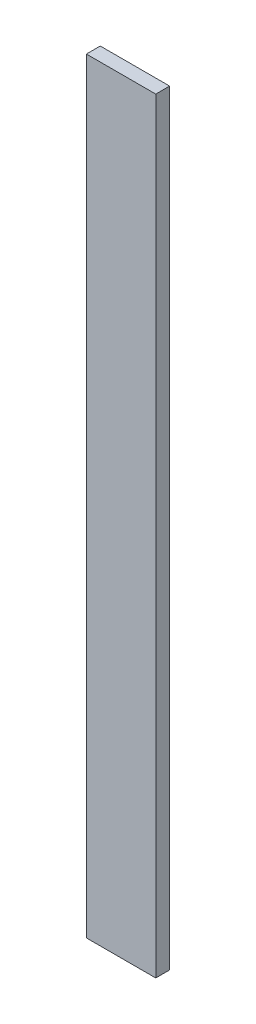
ISO-10303-21;
HEADER;
FILE_DESCRIPTION(('STEP AP214'),'2;1');
FILE_NAME('part.step','',(''),(''),'','','');
FILE_SCHEMA(('AUTOMOTIVE_DESIGN { 1 0 10303 214 1 1 1 1 }'));
ENDSEC;
DATA;
#1=APPLICATION_CONTEXT('core data for automotive mechanical design processes');
#2=APPLICATION_PROTOCOL_DEFINITION('international standard','automotive_design',2000,#1);
#3=PRODUCT_CONTEXT('',#1,'mechanical');
#4=PRODUCT('Part','Part','',(#3));
#5=PRODUCT_RELATED_PRODUCT_CATEGORY('part','',(#4));
#6=PRODUCT_DEFINITION_FORMATION('','',#4);
#7=PRODUCT_DEFINITION_CONTEXT('part definition',#1,'design');
#8=PRODUCT_DEFINITION('design','',#6,#7);
#9=PRODUCT_DEFINITION_SHAPE('','',#8);
#10=(LENGTH_UNIT() NAMED_UNIT(*) SI_UNIT(.MILLI.,.METRE.));
#11=(NAMED_UNIT(*) PLANE_ANGLE_UNIT() SI_UNIT($,.RADIAN.));
#12=(NAMED_UNIT(*) SI_UNIT($,.STERADIAN.) SOLID_ANGLE_UNIT());
#13=UNCERTAINTY_MEASURE_WITH_UNIT(LENGTH_MEASURE(1.E-05),#10,'distance_accuracy_value','');
#14=(GEOMETRIC_REPRESENTATION_CONTEXT(3) GLOBAL_UNCERTAINTY_ASSIGNED_CONTEXT((#13)) GLOBAL_UNIT_ASSIGNED_CONTEXT((#10,
#11,#12)) REPRESENTATION_CONTEXT('',''));
#15=CARTESIAN_POINT('',(0.,0.,0.));
#16=DIRECTION('',(0.,0.,1.));
#17=DIRECTION('',(1.,0.,0.));
#18=AXIS2_PLACEMENT_3D('',#15,#16,#17);
#19=CARTESIAN_POINT('',(7.5,-82.75,3.));
#20=DIRECTION('',(-1.,0.,0.));
#21=DIRECTION('',(0.,0.,1.));
#22=AXIS2_PLACEMENT_3D('',#19,#20,#21);
#23=PLANE('',#22);
#24=DIRECTION('',(0.,1.,0.));
#25=VECTOR('',#24,1.);
#26=CARTESIAN_POINT('',(7.5,-82.75,0.));
#27=LINE('',#26,#25);
#28=CARTESIAN_POINT('',(7.5,-82.75,0.));
#29=VERTEX_POINT('',#28);
#30=CARTESIAN_POINT('',(7.5,82.75,0.));
#31=VERTEX_POINT('',#30);
#32=EDGE_CURVE('E106',#29,#31,#27,.T.);
#33=ORIENTED_EDGE('',*,*,#32,.T.);
#34=DIRECTION('',(0.,0.,-1.));
#35=VECTOR('',#34,1.);
#36=CARTESIAN_POINT('',(7.5,82.75,3.));
#37=LINE('',#36,#35);
#38=CARTESIAN_POINT('',(7.5,82.75,3.));
#39=VERTEX_POINT('',#38);
#40=EDGE_CURVE('E11',#39,#31,#37,.T.);
#41=ORIENTED_EDGE('',*,*,#40,.F.);
#42=DIRECTION('',(0.,1.,0.));
#43=VECTOR('',#42,1.);
#44=CARTESIAN_POINT('',(7.5,-82.75,3.));
#45=LINE('',#44,#43);
#46=CARTESIAN_POINT('',(7.5,-82.75,3.));
#47=VERTEX_POINT('',#46);
#48=EDGE_CURVE('E94',#47,#39,#45,.T.);
#49=ORIENTED_EDGE('',*,*,#48,.F.);
#50=DIRECTION('',(0.,0.,-1.));
#51=VECTOR('',#50,1.);
#52=CARTESIAN_POINT('',(7.5,-82.75,3.));
#53=LINE('',#52,#51);
#54=EDGE_CURVE('E102',#47,#29,#53,.T.);
#55=ORIENTED_EDGE('',*,*,#54,.T.);
#56=EDGE_LOOP('',(#33,#41,#49,#55));
#57=FACE_BOUND('',#56,.T.);
#58=ADVANCED_FACE('F43',(#57),#23,.F.);
#59=CARTESIAN_POINT('',(-7.5,82.75,3.));
#60=DIRECTION('',(0.,-1.,0.));
#61=DIRECTION('',(0.,0.,-1.));
#62=AXIS2_PLACEMENT_3D('',#59,#60,#61);
#63=PLANE('',#62);
#64=DIRECTION('',(-1.,0.,0.));
#65=VECTOR('',#64,1.);
#66=CARTESIAN_POINT('',(-7.5,82.75,0.));
#67=LINE('',#66,#65);
#68=CARTESIAN_POINT('',(-7.5,82.75,0.));
#69=VERTEX_POINT('',#68);
#70=EDGE_CURVE('E98',#31,#69,#67,.T.);
#71=ORIENTED_EDGE('',*,*,#70,.T.);
#72=DIRECTION('',(0.,0.,-1.));
#73=VECTOR('',#72,1.);
#74=CARTESIAN_POINT('',(-7.5,82.75,3.));
#75=LINE('',#74,#73);
#76=CARTESIAN_POINT('',(-7.5,82.75,3.));
#77=VERTEX_POINT('',#76);
#78=EDGE_CURVE('E51',#77,#69,#75,.T.);
#79=ORIENTED_EDGE('',*,*,#78,.F.);
#80=DIRECTION('',(-1.,0.,0.));
#81=VECTOR('',#80,1.);
#82=CARTESIAN_POINT('',(-7.5,82.75,3.));
#83=LINE('',#82,#81);
#84=EDGE_CURVE('E89',#39,#77,#83,.T.);
#85=ORIENTED_EDGE('',*,*,#84,.F.);
#86=ORIENTED_EDGE('',*,*,#40,.T.);
#87=EDGE_LOOP('',(#71,#79,#85,#86));
#88=FACE_BOUND('',#87,.T.);
#89=ADVANCED_FACE('F97',(#88),#63,.F.);
#90=CARTESIAN_POINT('',(-7.5,-82.75,3.));
#91=DIRECTION('',(1.,0.,0.));
#92=DIRECTION('',(0.,0.,-1.));
#93=AXIS2_PLACEMENT_3D('',#90,#91,#92);
#94=PLANE('',#93);
#95=DIRECTION('',(0.,-1.,0.));
#96=VECTOR('',#95,1.);
#97=CARTESIAN_POINT('',(-7.5,-82.75,0.));
#98=LINE('',#97,#96);
#99=CARTESIAN_POINT('',(-7.5,-82.75,0.));
#100=VERTEX_POINT('',#99);
#101=EDGE_CURVE('E76',#69,#100,#98,.T.);
#102=ORIENTED_EDGE('',*,*,#101,.T.);
#103=DIRECTION('',(0.,0.,-1.));
#104=VECTOR('',#103,1.);
#105=CARTESIAN_POINT('',(-7.5,-82.75,3.));
#106=LINE('',#105,#104);
#107=CARTESIAN_POINT('',(-7.5,-82.75,3.));
#108=VERTEX_POINT('',#107);
#109=EDGE_CURVE('E99',#108,#100,#106,.T.);
#110=ORIENTED_EDGE('',*,*,#109,.F.);
#111=DIRECTION('',(0.,-1.,0.));
#112=VECTOR('',#111,1.);
#113=CARTESIAN_POINT('',(-7.5,-82.75,3.));
#114=LINE('',#113,#112);
#115=EDGE_CURVE('E92',#77,#108,#114,.T.);
#116=ORIENTED_EDGE('',*,*,#115,.F.);
#117=ORIENTED_EDGE('',*,*,#78,.T.);
#118=EDGE_LOOP('',(#102,#110,#116,#117));
#119=FACE_BOUND('',#118,.T.);
#120=ADVANCED_FACE('F100',(#119),#94,.F.);
#121=CARTESIAN_POINT('',(-7.5,-82.75,3.));
#122=DIRECTION('',(0.,1.,0.));
#123=DIRECTION('',(0.,0.,1.));
#124=AXIS2_PLACEMENT_3D('',#121,#122,#123);
#125=PLANE('',#124);
#126=DIRECTION('',(1.,0.,0.));
#127=VECTOR('',#126,1.);
#128=CARTESIAN_POINT('',(-7.5,-82.75,0.));
#129=LINE('',#128,#127);
#130=EDGE_CURVE('E82',#100,#29,#129,.T.);
#131=ORIENTED_EDGE('',*,*,#130,.T.);
#132=ORIENTED_EDGE('',*,*,#54,.F.);
#133=DIRECTION('',(1.,0.,0.));
#134=VECTOR('',#133,1.);
#135=CARTESIAN_POINT('',(-7.5,-82.75,3.));
#136=LINE('',#135,#134);
#137=EDGE_CURVE('E59',#108,#47,#136,.T.);
#138=ORIENTED_EDGE('',*,*,#137,.F.);
#139=ORIENTED_EDGE('',*,*,#109,.T.);
#140=EDGE_LOOP('',(#131,#132,#138,#139));
#141=FACE_BOUND('',#140,.T.);
#142=ADVANCED_FACE('F113',(#141),#125,.F.);
#143=CARTESIAN_POINT('',(0.,0.,3.));
#144=DIRECTION('',(0.,0.,-1.));
#145=DIRECTION('',(-1.,0.,0.));
#146=AXIS2_PLACEMENT_3D('',#143,#144,#145);
#147=PLANE('',#146);
#148=ORIENTED_EDGE('',*,*,#48,.T.);
#149=ORIENTED_EDGE('',*,*,#84,.T.);
#150=ORIENTED_EDGE('',*,*,#115,.T.);
#151=ORIENTED_EDGE('',*,*,#137,.T.);
#152=EDGE_LOOP('',(#148,#149,#150,#151));
#153=FACE_BOUND('',#152,.T.);
#154=ADVANCED_FACE('F90',(#153),#147,.F.);
#155=CARTESIAN_POINT('',(0.,0.,0.));
#156=DIRECTION('',(0.,0.,-1.));
#157=DIRECTION('',(-1.,0.,0.));
#158=AXIS2_PLACEMENT_3D('',#155,#156,#157);
#159=PLANE('',#158);
#160=ORIENTED_EDGE('',*,*,#32,.F.);
#161=ORIENTED_EDGE('',*,*,#130,.F.);
#162=ORIENTED_EDGE('',*,*,#101,.F.);
#163=ORIENTED_EDGE('',*,*,#70,.F.);
#164=EDGE_LOOP('',(#160,#161,#162,#163));
#165=FACE_BOUND('',#164,.T.);
#166=ADVANCED_FACE('F116',(#165),#159,.T.);
#167=CLOSED_SHELL('',(#58,#89,#120,#142,#154,#166));
#168=MANIFOLD_SOLID_BREP('B2',#167);
#169=ADVANCED_BREP_SHAPE_REPRESENTATION('',(#18,#168),#14);
#170=SHAPE_DEFINITION_REPRESENTATION(#9,#169);
ENDSEC;
END-ISO-10303-21;
